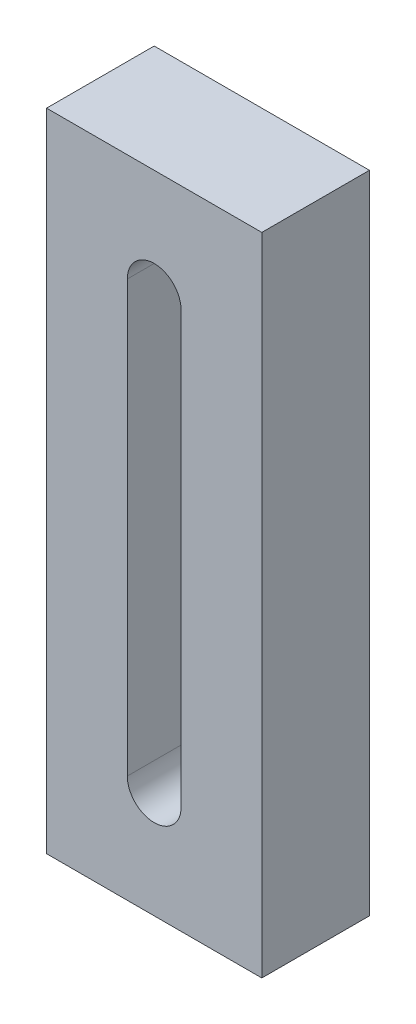
ISO-10303-21;
HEADER;
FILE_DESCRIPTION(('STEP AP214'),'2;1');
FILE_NAME('part.step','',(''),(''),'','','');
FILE_SCHEMA(('AUTOMOTIVE_DESIGN { 1 0 10303 214 1 1 1 1 }'));
ENDSEC;
DATA;
#1=APPLICATION_CONTEXT('core data for automotive mechanical design processes');
#2=APPLICATION_PROTOCOL_DEFINITION('international standard','automotive_design',2000,#1);
#3=PRODUCT_CONTEXT('',#1,'mechanical');
#4=PRODUCT('Part','Part','',(#3));
#5=PRODUCT_RELATED_PRODUCT_CATEGORY('part','',(#4));
#6=PRODUCT_DEFINITION_FORMATION('','',#4);
#7=PRODUCT_DEFINITION_CONTEXT('part definition',#1,'design');
#8=PRODUCT_DEFINITION('design','',#6,#7);
#9=PRODUCT_DEFINITION_SHAPE('','',#8);
#10=(LENGTH_UNIT() NAMED_UNIT(*) SI_UNIT(.MILLI.,.METRE.));
#11=(NAMED_UNIT(*) PLANE_ANGLE_UNIT() SI_UNIT($,.RADIAN.));
#12=(NAMED_UNIT(*) SI_UNIT($,.STERADIAN.) SOLID_ANGLE_UNIT());
#13=UNCERTAINTY_MEASURE_WITH_UNIT(LENGTH_MEASURE(1.E-05),#10,'distance_accuracy_value','');
#14=(GEOMETRIC_REPRESENTATION_CONTEXT(3) GLOBAL_UNCERTAINTY_ASSIGNED_CONTEXT((#13)) GLOBAL_UNIT_ASSIGNED_CONTEXT((#10,
#11,#12)) REPRESENTATION_CONTEXT('',''));
#15=CARTESIAN_POINT('',(0.,0.,0.));
#16=DIRECTION('',(0.,0.,1.));
#17=DIRECTION('',(1.,0.,0.));
#18=AXIS2_PLACEMENT_3D('',#15,#16,#17);
#19=CARTESIAN_POINT('',(50.8,-76.2,25.4));
#20=DIRECTION('',(-1.,0.,0.));
#21=DIRECTION('',(0.,0.,1.));
#22=AXIS2_PLACEMENT_3D('',#19,#20,#21);
#23=PLANE('',#22);
#24=DIRECTION('',(0.,1.,0.));
#25=VECTOR('',#24,1.);
#26=CARTESIAN_POINT('',(50.8,-76.2,0.));
#27=LINE('',#26,#25);
#28=CARTESIAN_POINT('',(50.8,-76.2,0.));
#29=VERTEX_POINT('',#28);
#30=CARTESIAN_POINT('',(50.8,76.2,0.));
#31=VERTEX_POINT('',#30);
#32=EDGE_CURVE('E151',#29,#31,#27,.T.);
#33=ORIENTED_EDGE('',*,*,#32,.T.);
#34=DIRECTION('',(0.,0.,-1.));
#35=VECTOR('',#34,1.);
#36=CARTESIAN_POINT('',(50.8,76.2,25.4));
#37=LINE('',#36,#35);
#38=CARTESIAN_POINT('',(50.8,76.2,25.4));
#39=VERTEX_POINT('',#38);
#40=EDGE_CURVE('E11',#39,#31,#37,.T.);
#41=ORIENTED_EDGE('',*,*,#40,.F.);
#42=DIRECTION('',(0.,1.,0.));
#43=VECTOR('',#42,1.);
#44=CARTESIAN_POINT('',(50.8,-76.2,25.4));
#45=LINE('',#44,#43);
#46=CARTESIAN_POINT('',(50.8,-76.2,25.4));
#47=VERTEX_POINT('',#46);
#48=EDGE_CURVE('E160',#47,#39,#45,.T.);
#49=ORIENTED_EDGE('',*,*,#48,.F.);
#50=DIRECTION('',(0.,0.,-1.));
#51=VECTOR('',#50,1.);
#52=CARTESIAN_POINT('',(50.8,-76.2,25.4));
#53=LINE('',#52,#51);
#54=EDGE_CURVE('E141',#47,#29,#53,.T.);
#55=ORIENTED_EDGE('',*,*,#54,.T.);
#56=EDGE_LOOP('',(#33,#41,#49,#55));
#57=FACE_BOUND('',#56,.T.);
#58=ADVANCED_FACE('F45',(#57),#23,.F.);
#59=CARTESIAN_POINT('',(50.8,76.2,25.4));
#60=DIRECTION('',(0.,-1.,0.));
#61=DIRECTION('',(0.,0.,-1.));
#62=AXIS2_PLACEMENT_3D('',#59,#60,#61);
#63=PLANE('',#62);
#64=DIRECTION('',(-1.,0.,0.));
#65=VECTOR('',#64,1.);
#66=CARTESIAN_POINT('',(50.8,76.2,0.));
#67=LINE('',#66,#65);
#68=CARTESIAN_POINT('',(0.,76.2,0.));
#69=VERTEX_POINT('',#68);
#70=EDGE_CURVE('E101',#31,#69,#67,.T.);
#71=ORIENTED_EDGE('',*,*,#70,.T.);
#72=DIRECTION('',(0.,0.,-1.));
#73=VECTOR('',#72,1.);
#74=CARTESIAN_POINT('',(0.,76.2,25.4));
#75=LINE('',#74,#73);
#76=CARTESIAN_POINT('',(0.,76.2,25.4));
#77=VERTEX_POINT('',#76);
#78=EDGE_CURVE('E54',#77,#69,#75,.T.);
#79=ORIENTED_EDGE('',*,*,#78,.F.);
#80=DIRECTION('',(-1.,0.,0.));
#81=VECTOR('',#80,1.);
#82=CARTESIAN_POINT('',(50.8,76.2,25.4));
#83=LINE('',#82,#81);
#84=EDGE_CURVE('E124',#39,#77,#83,.T.);
#85=ORIENTED_EDGE('',*,*,#84,.F.);
#86=ORIENTED_EDGE('',*,*,#40,.T.);
#87=EDGE_LOOP('',(#71,#79,#85,#86));
#88=FACE_BOUND('',#87,.T.);
#89=ADVANCED_FACE('F198',(#88),#63,.F.);
#90=CARTESIAN_POINT('',(0.,76.2,25.4));
#91=DIRECTION('',(1.,0.,0.));
#92=DIRECTION('',(0.,0.,-1.));
#93=AXIS2_PLACEMENT_3D('',#90,#91,#92);
#94=PLANE('',#93);
#95=DIRECTION('',(0.,-1.,0.));
#96=VECTOR('',#95,1.);
#97=CARTESIAN_POINT('',(0.,76.2,0.));
#98=LINE('',#97,#96);
#99=CARTESIAN_POINT('',(0.,-76.2,0.));
#100=VERTEX_POINT('',#99);
#101=EDGE_CURVE('E109',#69,#100,#98,.T.);
#102=ORIENTED_EDGE('',*,*,#101,.T.);
#103=DIRECTION('',(0.,0.,-1.));
#104=VECTOR('',#103,1.);
#105=CARTESIAN_POINT('',(0.,-76.2,25.4));
#106=LINE('',#105,#104);
#107=CARTESIAN_POINT('',(0.,-76.2,25.4));
#108=VERTEX_POINT('',#107);
#109=EDGE_CURVE('E138',#108,#100,#106,.T.);
#110=ORIENTED_EDGE('',*,*,#109,.F.);
#111=DIRECTION('',(0.,-1.,0.));
#112=VECTOR('',#111,1.);
#113=CARTESIAN_POINT('',(0.,76.2,25.4));
#114=LINE('',#113,#112);
#115=EDGE_CURVE('E132',#77,#108,#114,.T.);
#116=ORIENTED_EDGE('',*,*,#115,.F.);
#117=ORIENTED_EDGE('',*,*,#78,.T.);
#118=EDGE_LOOP('',(#102,#110,#116,#117));
#119=FACE_BOUND('',#118,.T.);
#120=ADVANCED_FACE('F139',(#119),#94,.F.);
#121=CARTESIAN_POINT('',(0.,-76.2,25.4));
#122=DIRECTION('',(0.,1.,0.));
#123=DIRECTION('',(0.,0.,1.));
#124=AXIS2_PLACEMENT_3D('',#121,#122,#123);
#125=PLANE('',#124);
#126=DIRECTION('',(1.,0.,0.));
#127=VECTOR('',#126,1.);
#128=CARTESIAN_POINT('',(0.,-76.2,0.));
#129=LINE('',#128,#127);
#130=EDGE_CURVE('E116',#100,#29,#129,.T.);
#131=ORIENTED_EDGE('',*,*,#130,.T.);
#132=ORIENTED_EDGE('',*,*,#54,.F.);
#133=DIRECTION('',(1.,0.,0.));
#134=VECTOR('',#133,1.);
#135=CARTESIAN_POINT('',(0.,-76.2,25.4));
#136=LINE('',#135,#134);
#137=EDGE_CURVE('E135',#108,#47,#136,.T.);
#138=ORIENTED_EDGE('',*,*,#137,.F.);
#139=ORIENTED_EDGE('',*,*,#109,.T.);
#140=EDGE_LOOP('',(#131,#132,#138,#139));
#141=FACE_BOUND('',#140,.T.);
#142=ADVANCED_FACE('F143',(#141),#125,.F.);
#143=CARTESIAN_POINT('',(0.,0.,25.4));
#144=DIRECTION('',(0.,0.,1.));
#145=DIRECTION('',(1.,0.,0.));
#146=AXIS2_PLACEMENT_3D('',#143,#144,#145);
#147=PLANE('',#146);
#148=CARTESIAN_POINT('',(25.4,50.8,25.4));
#149=DIRECTION('',(0.,0.,1.));
#150=DIRECTION('',(1.,0.,0.));
#151=AXIS2_PLACEMENT_3D('',#148,#149,#150);
#152=CIRCLE('',#151,6.35);
#153=CARTESIAN_POINT('',(31.75,50.8,25.4));
#154=VERTEX_POINT('',#153);
#155=CARTESIAN_POINT('',(19.05,50.8,25.4));
#156=VERTEX_POINT('',#155);
#157=EDGE_CURVE('E48',#154,#156,#152,.T.);
#158=ORIENTED_EDGE('',*,*,#157,.F.);
#159=DIRECTION('',(0.,1.,0.));
#160=VECTOR('',#159,1.);
#161=CARTESIAN_POINT('',(31.75,0.,25.4));
#162=LINE('',#161,#160);
#163=CARTESIAN_POINT('',(31.75,-50.8,25.4));
#164=VERTEX_POINT('',#163);
#165=EDGE_CURVE('E92',#154,#164,#162,.F.);
#166=ORIENTED_EDGE('',*,*,#165,.T.);
#167=CARTESIAN_POINT('',(25.4,-50.8,25.4));
#168=DIRECTION('',(0.,0.,1.));
#169=DIRECTION('',(1.,0.,0.));
#170=AXIS2_PLACEMENT_3D('',#167,#168,#169);
#171=CIRCLE('',#170,6.35);
#172=CARTESIAN_POINT('',(19.05,-50.8,25.4));
#173=VERTEX_POINT('',#172);
#174=EDGE_CURVE('E167',#173,#164,#171,.T.);
#175=ORIENTED_EDGE('',*,*,#174,.F.);
#176=DIRECTION('',(0.,1.,0.));
#177=VECTOR('',#176,1.);
#178=CARTESIAN_POINT('',(19.05,50.8,25.4));
#179=LINE('',#178,#177);
#180=EDGE_CURVE('E164',#156,#173,#179,.F.);
#181=ORIENTED_EDGE('',*,*,#180,.F.);
#182=EDGE_LOOP('',(#158,#166,#175,#181));
#183=FACE_BOUND('',#182,.T.);
#184=ORIENTED_EDGE('',*,*,#48,.T.);
#185=ORIENTED_EDGE('',*,*,#84,.T.);
#186=ORIENTED_EDGE('',*,*,#115,.T.);
#187=ORIENTED_EDGE('',*,*,#137,.T.);
#188=EDGE_LOOP('',(#184,#185,#186,#187));
#189=FACE_BOUND('',#188,.T.);
#190=ADVANCED_FACE('F133',(#183,#189),#147,.T.);
#191=CARTESIAN_POINT('',(0.,0.,0.));
#192=DIRECTION('',(0.,0.,1.));
#193=DIRECTION('',(1.,0.,0.));
#194=AXIS2_PLACEMENT_3D('',#191,#192,#193);
#195=PLANE('',#194);
#196=DIRECTION('',(0.,-1.,0.));
#197=VECTOR('',#196,1.);
#198=CARTESIAN_POINT('',(31.75,50.8,0.));
#199=LINE('',#198,#197);
#200=CARTESIAN_POINT('',(31.75,50.8,0.));
#201=VERTEX_POINT('',#200);
#202=CARTESIAN_POINT('',(31.75,-50.8,0.));
#203=VERTEX_POINT('',#202);
#204=EDGE_CURVE('E190',#201,#203,#199,.T.);
#205=ORIENTED_EDGE('',*,*,#204,.F.);
#206=CARTESIAN_POINT('',(25.4,50.8,0.));
#207=DIRECTION('',(0.,0.,1.));
#208=DIRECTION('',(1.,0.,0.));
#209=AXIS2_PLACEMENT_3D('',#206,#207,#208);
#210=CIRCLE('',#209,6.35);
#211=CARTESIAN_POINT('',(19.05,50.8,0.));
#212=VERTEX_POINT('',#211);
#213=EDGE_CURVE('E272',#201,#212,#210,.T.);
#214=ORIENTED_EDGE('',*,*,#213,.T.);
#215=DIRECTION('',(0.,-1.,0.));
#216=VECTOR('',#215,1.);
#217=CARTESIAN_POINT('',(19.05,50.8,0.));
#218=LINE('',#217,#216);
#219=CARTESIAN_POINT('',(19.05,-50.8,0.));
#220=VERTEX_POINT('',#219);
#221=EDGE_CURVE('E274',#212,#220,#218,.T.);
#222=ORIENTED_EDGE('',*,*,#221,.T.);
#223=CARTESIAN_POINT('',(25.4,-50.8,0.));
#224=DIRECTION('',(0.,0.,1.));
#225=DIRECTION('',(1.,0.,0.));
#226=AXIS2_PLACEMENT_3D('',#223,#224,#225);
#227=CIRCLE('',#226,6.35);
#228=EDGE_CURVE('E71',#220,#203,#227,.T.);
#229=ORIENTED_EDGE('',*,*,#228,.T.);
#230=EDGE_LOOP('',(#205,#214,#222,#229));
#231=FACE_BOUND('',#230,.T.);
#232=ORIENTED_EDGE('',*,*,#32,.F.);
#233=ORIENTED_EDGE('',*,*,#130,.F.);
#234=ORIENTED_EDGE('',*,*,#101,.F.);
#235=ORIENTED_EDGE('',*,*,#70,.F.);
#236=EDGE_LOOP('',(#232,#233,#234,#235));
#237=FACE_BOUND('',#236,.T.);
#238=ADVANCED_FACE('F199',(#231,#237),#195,.F.);
#239=CARTESIAN_POINT('',(25.4,50.8,0.));
#240=DIRECTION('',(0.,0.,1.));
#241=DIRECTION('',(1.,0.,0.));
#242=AXIS2_PLACEMENT_3D('',#239,#240,#241);
#243=CYLINDRICAL_SURFACE('',#242,6.35);
#244=ORIENTED_EDGE('',*,*,#157,.T.);
#245=DIRECTION('',(0.,0.,1.));
#246=VECTOR('',#245,1.);
#247=CARTESIAN_POINT('',(19.05,50.8,0.));
#248=LINE('',#247,#246);
#249=EDGE_CURVE('E62',#212,#156,#248,.T.);
#250=ORIENTED_EDGE('',*,*,#249,.F.);
#251=ORIENTED_EDGE('',*,*,#213,.F.);
#252=DIRECTION('',(0.,0.,1.));
#253=VECTOR('',#252,1.);
#254=CARTESIAN_POINT('',(31.75,50.8,0.));
#255=LINE('',#254,#253);
#256=EDGE_CURVE('E168',#201,#154,#255,.T.);
#257=ORIENTED_EDGE('',*,*,#256,.T.);
#258=EDGE_LOOP('',(#244,#250,#251,#257));
#259=FACE_BOUND('',#258,.T.);
#260=ADVANCED_FACE('F177',(#259),#243,.F.);
#261=CARTESIAN_POINT('',(31.75,50.8,0.));
#262=DIRECTION('',(-1.,0.,0.));
#263=DIRECTION('',(0.,0.,1.));
#264=AXIS2_PLACEMENT_3D('',#261,#262,#263);
#265=PLANE('',#264);
#266=ORIENTED_EDGE('',*,*,#256,.F.);
#267=ORIENTED_EDGE('',*,*,#204,.T.);
#268=DIRECTION('',(0.,0.,1.));
#269=VECTOR('',#268,1.);
#270=CARTESIAN_POINT('',(31.75,-50.8,0.));
#271=LINE('',#270,#269);
#272=EDGE_CURVE('E185',#203,#164,#271,.T.);
#273=ORIENTED_EDGE('',*,*,#272,.T.);
#274=ORIENTED_EDGE('',*,*,#165,.F.);
#275=EDGE_LOOP('',(#266,#267,#273,#274));
#276=FACE_BOUND('',#275,.T.);
#277=ADVANCED_FACE('F207',(#276),#265,.T.);
#278=CARTESIAN_POINT('',(25.4,-50.8,0.));
#279=DIRECTION('',(0.,0.,1.));
#280=DIRECTION('',(1.,0.,0.));
#281=AXIS2_PLACEMENT_3D('',#278,#279,#280);
#282=CYLINDRICAL_SURFACE('',#281,6.35);
#283=ORIENTED_EDGE('',*,*,#174,.T.);
#284=ORIENTED_EDGE('',*,*,#272,.F.);
#285=ORIENTED_EDGE('',*,*,#228,.F.);
#286=DIRECTION('',(0.,0.,1.));
#287=VECTOR('',#286,1.);
#288=CARTESIAN_POINT('',(19.05,-50.8,0.));
#289=LINE('',#288,#287);
#290=EDGE_CURVE('E181',#220,#173,#289,.T.);
#291=ORIENTED_EDGE('',*,*,#290,.T.);
#292=EDGE_LOOP('',(#283,#284,#285,#291));
#293=FACE_BOUND('',#292,.T.);
#294=ADVANCED_FACE('F183',(#293),#282,.F.);
#295=CARTESIAN_POINT('',(19.05,50.8,0.));
#296=DIRECTION('',(-1.,0.,0.));
#297=DIRECTION('',(0.,0.,1.));
#298=AXIS2_PLACEMENT_3D('',#295,#296,#297);
#299=PLANE('',#298);
#300=ORIENTED_EDGE('',*,*,#180,.T.);
#301=ORIENTED_EDGE('',*,*,#290,.F.);
#302=ORIENTED_EDGE('',*,*,#221,.F.);
#303=ORIENTED_EDGE('',*,*,#249,.T.);
#304=EDGE_LOOP('',(#300,#301,#302,#303));
#305=FACE_BOUND('',#304,.T.);
#306=ADVANCED_FACE('F180',(#305),#299,.F.);
#307=CLOSED_SHELL('',(#58,#89,#120,#142,#190,#238,#260,#277,#294,#306));
#308=MANIFOLD_SOLID_BREP('B2',#307);
#309=ADVANCED_BREP_SHAPE_REPRESENTATION('',(#18,#308),#14);
#310=SHAPE_DEFINITION_REPRESENTATION(#9,#309);
ENDSEC;
END-ISO-10303-21;
